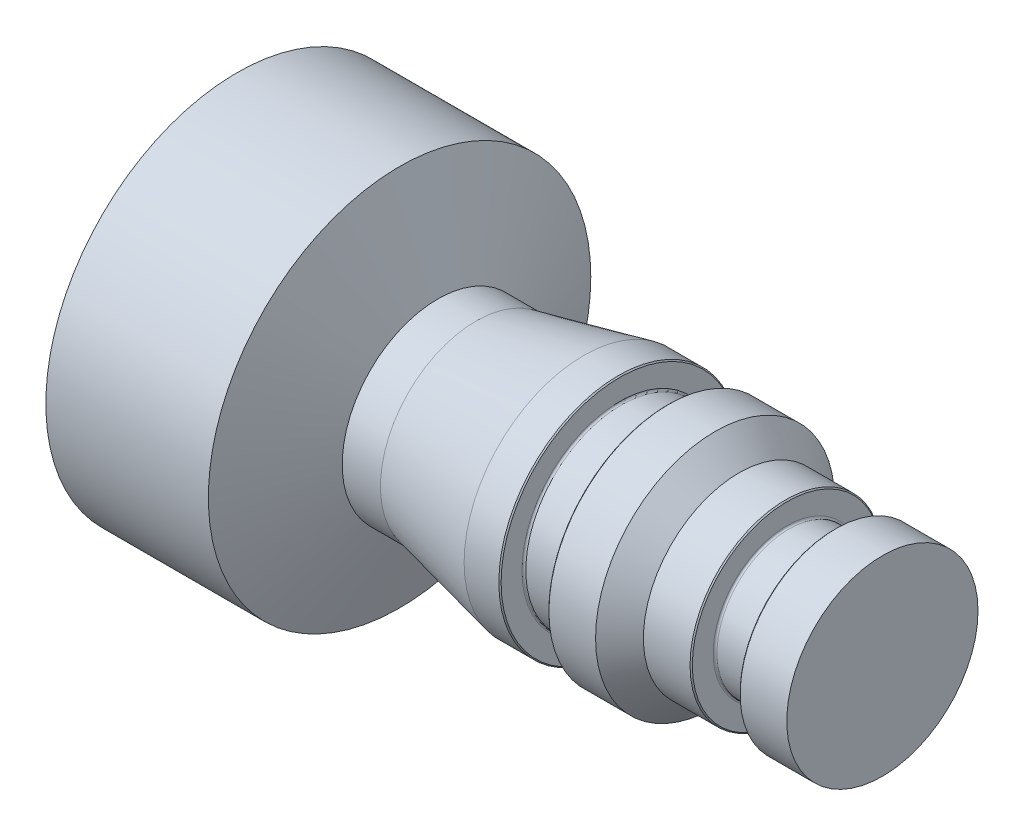
ISO-10303-21;
HEADER;
FILE_DESCRIPTION(('STEP AP214'),'2;1');
FILE_NAME('part.step','',(''),(''),'','','');
FILE_SCHEMA(('AUTOMOTIVE_DESIGN { 1 0 10303 214 1 1 1 1 }'));
ENDSEC;
DATA;
#1=APPLICATION_CONTEXT('core data for automotive mechanical design processes');
#2=APPLICATION_PROTOCOL_DEFINITION('international standard','automotive_design',2000,#1);
#3=PRODUCT_CONTEXT('',#1,'mechanical');
#4=PRODUCT('Part','Part','',(#3));
#5=PRODUCT_RELATED_PRODUCT_CATEGORY('part','',(#4));
#6=PRODUCT_DEFINITION_FORMATION('','',#4);
#7=PRODUCT_DEFINITION_CONTEXT('part definition',#1,'design');
#8=PRODUCT_DEFINITION('design','',#6,#7);
#9=PRODUCT_DEFINITION_SHAPE('','',#8);
#10=(LENGTH_UNIT() NAMED_UNIT(*) SI_UNIT(.MILLI.,.METRE.));
#11=(NAMED_UNIT(*) PLANE_ANGLE_UNIT() SI_UNIT($,.RADIAN.));
#12=(NAMED_UNIT(*) SI_UNIT($,.STERADIAN.) SOLID_ANGLE_UNIT());
#13=UNCERTAINTY_MEASURE_WITH_UNIT(LENGTH_MEASURE(1.E-05),#10,'distance_accuracy_value','');
#14=(GEOMETRIC_REPRESENTATION_CONTEXT(3) GLOBAL_UNCERTAINTY_ASSIGNED_CONTEXT((#13)) GLOBAL_UNIT_ASSIGNED_CONTEXT((#10,
#11,#12)) REPRESENTATION_CONTEXT('',''));
#15=CARTESIAN_POINT('',(0.,0.,0.));
#16=DIRECTION('',(0.,0.,1.));
#17=DIRECTION('',(1.,0.,0.));
#18=AXIS2_PLACEMENT_3D('',#15,#16,#17);
#19=CARTESIAN_POINT('',(-13.208,0.,0.));
#20=DIRECTION('',(1.,0.,0.));
#21=DIRECTION('',(0.,0.,-1.));
#22=AXIS2_PLACEMENT_3D('',#19,#20,#21);
#23=TOROIDAL_SURFACE('',#22,19.558,0.508000000000001);
#24=CARTESIAN_POINT('',(-13.208,0.,0.));
#25=DIRECTION('',(1.,0.,0.));
#26=DIRECTION('',(0.,0.,-1.));
#27=AXIS2_PLACEMENT_3D('',#24,#25,#26);
#28=CIRCLE('',#27,19.05);
#29=CARTESIAN_POINT('',(-13.208,0.,-19.05));
#30=VERTEX_POINT('',#29);
#31=EDGE_CURVE('E110',#30,#30,#28,.T.);
#32=ORIENTED_EDGE('',*,*,#31,.T.);
#33=EDGE_LOOP('',(#32));
#34=FACE_BOUND('',#33,.T.);
#35=CARTESIAN_POINT('',(-12.7,0.,0.));
#36=DIRECTION('',(1.,0.,0.));
#37=DIRECTION('',(0.,0.,-1.));
#38=AXIS2_PLACEMENT_3D('',#35,#36,#37);
#39=CIRCLE('',#38,19.558);
#40=CARTESIAN_POINT('',(-12.7,0.,-19.558));
#41=VERTEX_POINT('',#40);
#42=EDGE_CURVE('E65',#41,#41,#39,.T.);
#43=ORIENTED_EDGE('',*,*,#42,.F.);
#44=EDGE_LOOP('',(#43));
#45=FACE_BOUND('',#44,.T.);
#46=ADVANCED_FACE('F34',(#34,#45),#23,.F.);
#47=CARTESIAN_POINT('',(-12.7,19.558,0.));
#48=DIRECTION('',(1.,0.,0.));
#49=DIRECTION('',(0.,0.,-1.));
#50=AXIS2_PLACEMENT_3D('',#47,#48,#49);
#51=PLANE('',#50);
#52=CARTESIAN_POINT('',(-12.7,0.,0.));
#53=DIRECTION('',(1.,0.,0.));
#54=DIRECTION('',(0.,0.,-1.));
#55=AXIS2_PLACEMENT_3D('',#52,#53,#54);
#56=CIRCLE('',#55,25.0951999999999);
#57=CARTESIAN_POINT('',(-12.7,0.,-25.0951999999999));
#58=VERTEX_POINT('',#57);
#59=EDGE_CURVE('E10',#58,#58,#56,.F.);
#60=ORIENTED_EDGE('',*,*,#59,.T.);
#61=EDGE_LOOP('',(#60));
#62=FACE_BOUND('',#61,.T.);
#63=ORIENTED_EDGE('',*,*,#42,.T.);
#64=EDGE_LOOP('',(#63));
#65=FACE_BOUND('',#64,.T.);
#66=ADVANCED_FACE('F133',(#62,#65),#51,.F.);
#67=CARTESIAN_POINT('',(0.,0.,0.));
#68=DIRECTION('',(1.,0.,0.));
#69=DIRECTION('',(0.,0.,-1.));
#70=AXIS2_PLACEMENT_3D('',#67,#68,#69);
#71=CYLINDRICAL_SURFACE('',#70,25.3999999999999);
#72=CARTESIAN_POINT('',(-12.3952,0.,0.));
#73=DIRECTION('',(1.,0.,0.));
#74=DIRECTION('',(0.,0.,-1.));
#75=AXIS2_PLACEMENT_3D('',#72,#73,#74);
#76=CIRCLE('',#75,25.3999999999999);
#77=CARTESIAN_POINT('',(-12.3952,0.,-25.3999999999999));
#78=VERTEX_POINT('',#77);
#79=EDGE_CURVE('E40',#78,#78,#76,.T.);
#80=ORIENTED_EDGE('',*,*,#79,.T.);
#81=EDGE_LOOP('',(#80));
#82=FACE_BOUND('',#81,.T.);
#83=CARTESIAN_POINT('',(0.,0.,0.));
#84=DIRECTION('',(1.,0.,0.));
#85=DIRECTION('',(0.,0.,-1.));
#86=AXIS2_PLACEMENT_3D('',#83,#84,#85);
#87=CIRCLE('',#86,25.3999999999999);
#88=CARTESIAN_POINT('',(0.,0.,-25.3999999999999));
#89=VERTEX_POINT('',#88);
#90=EDGE_CURVE('E68',#89,#89,#87,.T.);
#91=ORIENTED_EDGE('',*,*,#90,.F.);
#92=EDGE_LOOP('',(#91));
#93=FACE_BOUND('',#92,.T.);
#94=ADVANCED_FACE('F137',(#82,#93),#71,.T.);
#95=CARTESIAN_POINT('',(0.,0.,0.));
#96=DIRECTION('',(1.,0.,0.));
#97=DIRECTION('',(0.,0.,-1.));
#98=AXIS2_PLACEMENT_3D('',#95,#96,#97);
#99=PLANE('',#98);
#100=ORIENTED_EDGE('',*,*,#90,.T.);
#101=EDGE_LOOP('',(#100));
#102=FACE_BOUND('',#101,.T.);
#103=ADVANCED_FACE('F141',(#102),#99,.T.);
#104=CARTESIAN_POINT('',(-171.45,50.8,0.));
#105=DIRECTION('',(-1.,0.,0.));
#106=DIRECTION('',(0.,0.,1.));
#107=AXIS2_PLACEMENT_3D('',#104,#105,#106);
#108=PLANE('',#107);
#109=CARTESIAN_POINT('',(-171.45,0.,0.));
#110=DIRECTION('',(1.,0.,0.));
#111=DIRECTION('',(0.,0.,-1.));
#112=AXIS2_PLACEMENT_3D('',#109,#110,#111);
#113=CIRCLE('',#112,50.8);
#114=CARTESIAN_POINT('',(-171.45,0.,-50.8));
#115=VERTEX_POINT('',#114);
#116=EDGE_CURVE('E71',#115,#115,#113,.T.);
#117=ORIENTED_EDGE('',*,*,#116,.F.);
#118=EDGE_LOOP('',(#117));
#119=FACE_BOUND('',#118,.T.);
#120=ADVANCED_FACE('F147',(#119),#108,.T.);
#121=CARTESIAN_POINT('',(0.,0.,0.));
#122=DIRECTION('',(1.,0.,0.));
#123=DIRECTION('',(0.,0.,-1.));
#124=AXIS2_PLACEMENT_3D('',#121,#122,#123);
#125=CYLINDRICAL_SURFACE('',#124,50.8);
#126=ORIENTED_EDGE('',*,*,#116,.T.);
#127=EDGE_LOOP('',(#126));
#128=FACE_BOUND('',#127,.T.);
#129=CARTESIAN_POINT('',(-128.27,0.,0.));
#130=DIRECTION('',(1.,0.,0.));
#131=DIRECTION('',(0.,0.,-1.));
#132=AXIS2_PLACEMENT_3D('',#129,#130,#131);
#133=CIRCLE('',#132,50.8);
#134=CARTESIAN_POINT('',(-128.27,0.,-50.8));
#135=VERTEX_POINT('',#134);
#136=EDGE_CURVE('E74',#135,#135,#133,.T.);
#137=ORIENTED_EDGE('',*,*,#136,.F.);
#138=EDGE_LOOP('',(#137));
#139=FACE_BOUND('',#138,.T.);
#140=ADVANCED_FACE('F151',(#128,#139),#125,.T.);
#141=CARTESIAN_POINT('',(-118.11,0.,0.));
#142=DIRECTION('',(-1.,0.,0.));
#143=DIRECTION('',(0.,0.,1.));
#144=AXIS2_PLACEMENT_3D('',#141,#142,#143);
#145=CONICAL_SURFACE('',#144,25.4,1.19028994968253);
#146=ORIENTED_EDGE('',*,*,#136,.T.);
#147=EDGE_LOOP('',(#146));
#148=FACE_BOUND('',#147,.T.);
#149=CARTESIAN_POINT('',(-118.11,0.,0.));
#150=DIRECTION('',(1.,0.,0.));
#151=DIRECTION('',(0.,0.,-1.));
#152=AXIS2_PLACEMENT_3D('',#149,#150,#151);
#153=CIRCLE('',#152,25.4);
#154=CARTESIAN_POINT('',(-118.11,0.,-25.4));
#155=VERTEX_POINT('',#154);
#156=EDGE_CURVE('E77',#155,#155,#153,.T.);
#157=ORIENTED_EDGE('',*,*,#156,.F.);
#158=EDGE_LOOP('',(#157));
#159=FACE_BOUND('',#158,.T.);
#160=ADVANCED_FACE('F155',(#148,#159),#145,.T.);
#161=CARTESIAN_POINT('',(0.,0.,0.));
#162=DIRECTION('',(1.,0.,0.));
#163=DIRECTION('',(0.,0.,-1.));
#164=AXIS2_PLACEMENT_3D('',#161,#162,#163);
#165=CYLINDRICAL_SURFACE('',#164,25.4);
#166=ORIENTED_EDGE('',*,*,#156,.T.);
#167=EDGE_LOOP('',(#166));
#168=FACE_BOUND('',#167,.T.);
#169=CARTESIAN_POINT('',(-107.95,0.,0.));
#170=DIRECTION('',(1.,0.,0.));
#171=DIRECTION('',(0.,0.,-1.));
#172=AXIS2_PLACEMENT_3D('',#169,#170,#171);
#173=CIRCLE('',#172,25.4);
#174=CARTESIAN_POINT('',(-107.95,0.,-25.4));
#175=VERTEX_POINT('',#174);
#176=EDGE_CURVE('E80',#175,#175,#173,.T.);
#177=ORIENTED_EDGE('',*,*,#176,.F.);
#178=EDGE_LOOP('',(#177));
#179=FACE_BOUND('',#178,.T.);
#180=ADVANCED_FACE('F159',(#168,#179),#165,.T.);
#181=CARTESIAN_POINT('',(-79.375,0.,0.));
#182=DIRECTION('',(1.,0.,0.));
#183=DIRECTION('',(0.,0.,-1.));
#184=AXIS2_PLACEMENT_3D('',#181,#182,#183);
#185=CONICAL_SURFACE('',#184,31.75,0.218668945873942);
#186=ORIENTED_EDGE('',*,*,#176,.T.);
#187=EDGE_LOOP('',(#186));
#188=FACE_BOUND('',#187,.T.);
#189=CARTESIAN_POINT('',(-79.375,0.,0.));
#190=DIRECTION('',(1.,0.,0.));
#191=DIRECTION('',(0.,0.,-1.));
#192=AXIS2_PLACEMENT_3D('',#189,#190,#191);
#193=CIRCLE('',#192,31.75);
#194=CARTESIAN_POINT('',(-79.375,0.,-31.75));
#195=VERTEX_POINT('',#194);
#196=EDGE_CURVE('E83',#195,#195,#193,.T.);
#197=ORIENTED_EDGE('',*,*,#196,.F.);
#198=EDGE_LOOP('',(#197));
#199=FACE_BOUND('',#198,.T.);
#200=ADVANCED_FACE('F163',(#188,#199),#185,.T.);
#201=CARTESIAN_POINT('',(0.,0.,0.));
#202=DIRECTION('',(1.,0.,0.));
#203=DIRECTION('',(0.,0.,-1.));
#204=AXIS2_PLACEMENT_3D('',#201,#202,#203);
#205=CYLINDRICAL_SURFACE('',#204,31.75);
#206=CARTESIAN_POINT('',(-70.1548,0.,0.));
#207=DIRECTION('',(-1.,0.,0.));
#208=DIRECTION('',(0.,0.,1.));
#209=AXIS2_PLACEMENT_3D('',#206,#207,#208);
#210=CIRCLE('',#209,31.75);
#211=CARTESIAN_POINT('',(-70.1548,0.,31.75));
#212=VERTEX_POINT('',#211);
#213=EDGE_CURVE('E59',#212,#212,#210,.T.);
#214=ORIENTED_EDGE('',*,*,#213,.T.);
#215=EDGE_LOOP('',(#214));
#216=FACE_BOUND('',#215,.T.);
#217=ORIENTED_EDGE('',*,*,#196,.T.);
#218=EDGE_LOOP('',(#217));
#219=FACE_BOUND('',#218,.T.);
#220=ADVANCED_FACE('F167',(#216,#219),#205,.T.);
#221=CARTESIAN_POINT('',(-69.85,31.75,0.));
#222=DIRECTION('',(-1.,0.,0.));
#223=DIRECTION('',(0.,0.,1.));
#224=AXIS2_PLACEMENT_3D('',#221,#222,#223);
#225=PLANE('',#224);
#226=CARTESIAN_POINT('',(-69.85,0.,0.));
#227=DIRECTION('',(-1.,0.,0.));
#228=DIRECTION('',(0.,0.,1.));
#229=AXIS2_PLACEMENT_3D('',#226,#227,#228);
#230=CIRCLE('',#229,31.4452);
#231=CARTESIAN_POINT('',(-69.85,0.,31.4452));
#232=VERTEX_POINT('',#231);
#233=EDGE_CURVE('E62',#232,#232,#230,.F.);
#234=ORIENTED_EDGE('',*,*,#233,.T.);
#235=EDGE_LOOP('',(#234));
#236=FACE_BOUND('',#235,.T.);
#237=CARTESIAN_POINT('',(-69.85,0.,0.));
#238=DIRECTION('',(1.,0.,0.));
#239=DIRECTION('',(0.,0.,-1.));
#240=AXIS2_PLACEMENT_3D('',#237,#238,#239);
#241=CIRCLE('',#240,25.908);
#242=CARTESIAN_POINT('',(-69.85,0.,-25.908));
#243=VERTEX_POINT('',#242);
#244=EDGE_CURVE('E86',#243,#243,#241,.T.);
#245=ORIENTED_EDGE('',*,*,#244,.F.);
#246=EDGE_LOOP('',(#245));
#247=FACE_BOUND('',#246,.T.);
#248=ADVANCED_FACE('F171',(#236,#247),#225,.F.);
#249=CARTESIAN_POINT('',(-69.342,0.,0.));
#250=DIRECTION('',(1.,0.,0.));
#251=DIRECTION('',(0.,0.,-1.));
#252=AXIS2_PLACEMENT_3D('',#249,#250,#251);
#253=TOROIDAL_SURFACE('',#252,25.908,0.507999999999998);
#254=ORIENTED_EDGE('',*,*,#244,.T.);
#255=EDGE_LOOP('',(#254));
#256=FACE_BOUND('',#255,.T.);
#257=CARTESIAN_POINT('',(-69.342,0.,0.));
#258=DIRECTION('',(1.,0.,0.));
#259=DIRECTION('',(0.,0.,-1.));
#260=AXIS2_PLACEMENT_3D('',#257,#258,#259);
#261=CIRCLE('',#260,25.4);
#262=CARTESIAN_POINT('',(-69.342,0.,-25.4));
#263=VERTEX_POINT('',#262);
#264=EDGE_CURVE('E89',#263,#263,#261,.T.);
#265=ORIENTED_EDGE('',*,*,#264,.F.);
#266=EDGE_LOOP('',(#265));
#267=FACE_BOUND('',#266,.T.);
#268=ADVANCED_FACE('F175',(#256,#267),#253,.F.);
#269=CARTESIAN_POINT('',(0.,0.,0.));
#270=DIRECTION('',(1.,0.,0.));
#271=DIRECTION('',(0.,0.,-1.));
#272=AXIS2_PLACEMENT_3D('',#269,#270,#271);
#273=CYLINDRICAL_SURFACE('',#272,25.4);
#274=ORIENTED_EDGE('',*,*,#264,.T.);
#275=EDGE_LOOP('',(#274));
#276=FACE_BOUND('',#275,.T.);
#277=CARTESIAN_POINT('',(-57.658,0.,0.));
#278=DIRECTION('',(1.,0.,0.));
#279=DIRECTION('',(0.,0.,-1.));
#280=AXIS2_PLACEMENT_3D('',#277,#278,#279);
#281=CIRCLE('',#280,25.4);
#282=CARTESIAN_POINT('',(-57.658,0.,-25.4));
#283=VERTEX_POINT('',#282);
#284=EDGE_CURVE('E92',#283,#283,#281,.T.);
#285=ORIENTED_EDGE('',*,*,#284,.F.);
#286=EDGE_LOOP('',(#285));
#287=FACE_BOUND('',#286,.T.);
#288=ADVANCED_FACE('F179',(#276,#287),#273,.T.);
#289=CARTESIAN_POINT('',(-57.658,0.,0.));
#290=DIRECTION('',(1.,0.,0.));
#291=DIRECTION('',(0.,0.,-1.));
#292=AXIS2_PLACEMENT_3D('',#289,#290,#291);
#293=TOROIDAL_SURFACE('',#292,25.908,0.508000000000002);
#294=ORIENTED_EDGE('',*,*,#284,.T.);
#295=EDGE_LOOP('',(#294));
#296=FACE_BOUND('',#295,.T.);
#297=CARTESIAN_POINT('',(-57.15,0.,0.));
#298=DIRECTION('',(1.,0.,0.));
#299=DIRECTION('',(0.,0.,-1.));
#300=AXIS2_PLACEMENT_3D('',#297,#298,#299);
#301=CIRCLE('',#300,25.908);
#302=CARTESIAN_POINT('',(-57.15,0.,-25.908));
#303=VERTEX_POINT('',#302);
#304=EDGE_CURVE('E95',#303,#303,#301,.T.);
#305=ORIENTED_EDGE('',*,*,#304,.F.);
#306=EDGE_LOOP('',(#305));
#307=FACE_BOUND('',#306,.T.);
#308=ADVANCED_FACE('F183',(#296,#307),#293,.F.);
#309=CARTESIAN_POINT('',(-57.15,25.908,0.));
#310=DIRECTION('',(1.,0.,0.));
#311=DIRECTION('',(0.,0.,-1.));
#312=AXIS2_PLACEMENT_3D('',#309,#310,#311);
#313=PLANE('',#312);
#314=CARTESIAN_POINT('',(-57.15,0.,0.));
#315=DIRECTION('',(1.,0.,0.));
#316=DIRECTION('',(0.,0.,-1.));
#317=AXIS2_PLACEMENT_3D('',#314,#315,#316);
#318=CIRCLE('',#317,31.4452);
#319=CARTESIAN_POINT('',(-57.15,0.,-31.4452));
#320=VERTEX_POINT('',#319);
#321=EDGE_CURVE('E53',#320,#320,#318,.F.);
#322=ORIENTED_EDGE('',*,*,#321,.T.);
#323=EDGE_LOOP('',(#322));
#324=FACE_BOUND('',#323,.T.);
#325=ORIENTED_EDGE('',*,*,#304,.T.);
#326=EDGE_LOOP('',(#325));
#327=FACE_BOUND('',#326,.T.);
#328=ADVANCED_FACE('F187',(#324,#327),#313,.F.);
#329=CARTESIAN_POINT('',(0.,0.,0.));
#330=DIRECTION('',(1.,0.,0.));
#331=DIRECTION('',(0.,0.,-1.));
#332=AXIS2_PLACEMENT_3D('',#329,#330,#331);
#333=CYLINDRICAL_SURFACE('',#332,31.75);
#334=CARTESIAN_POINT('',(-56.8452,0.,0.));
#335=DIRECTION('',(1.,0.,0.));
#336=DIRECTION('',(0.,0.,-1.));
#337=AXIS2_PLACEMENT_3D('',#334,#335,#336);
#338=CIRCLE('',#337,31.75);
#339=CARTESIAN_POINT('',(-56.8452,0.,-31.75));
#340=VERTEX_POINT('',#339);
#341=EDGE_CURVE('E56',#340,#340,#338,.T.);
#342=ORIENTED_EDGE('',*,*,#341,.T.);
#343=EDGE_LOOP('',(#342));
#344=FACE_BOUND('',#343,.T.);
#345=CARTESIAN_POINT('',(-44.45,0.,0.));
#346=DIRECTION('',(1.,0.,0.));
#347=DIRECTION('',(0.,0.,-1.));
#348=AXIS2_PLACEMENT_3D('',#345,#346,#347);
#349=CIRCLE('',#348,31.75);
#350=CARTESIAN_POINT('',(-44.45,0.,-31.75));
#351=VERTEX_POINT('',#350);
#352=EDGE_CURVE('E98',#351,#351,#349,.T.);
#353=ORIENTED_EDGE('',*,*,#352,.F.);
#354=EDGE_LOOP('',(#353));
#355=FACE_BOUND('',#354,.T.);
#356=ADVANCED_FACE('F191',(#344,#355),#333,.T.);
#357=CARTESIAN_POINT('',(-38.1,0.,0.));
#358=DIRECTION('',(-1.,0.,0.));
#359=DIRECTION('',(0.,0.,1.));
#360=AXIS2_PLACEMENT_3D('',#357,#358,#359);
#361=CONICAL_SURFACE('',#360,25.4,0.785398163397448);
#362=ORIENTED_EDGE('',*,*,#352,.T.);
#363=EDGE_LOOP('',(#362));
#364=FACE_BOUND('',#363,.T.);
#365=CARTESIAN_POINT('',(-38.1,0.,0.));
#366=DIRECTION('',(1.,0.,0.));
#367=DIRECTION('',(0.,0.,-1.));
#368=AXIS2_PLACEMENT_3D('',#365,#366,#367);
#369=CIRCLE('',#368,25.4);
#370=CARTESIAN_POINT('',(-38.1,0.,-25.4));
#371=VERTEX_POINT('',#370);
#372=EDGE_CURVE('E101',#371,#371,#369,.T.);
#373=ORIENTED_EDGE('',*,*,#372,.F.);
#374=EDGE_LOOP('',(#373));
#375=FACE_BOUND('',#374,.T.);
#376=ADVANCED_FACE('F195',(#364,#375),#361,.T.);
#377=CARTESIAN_POINT('',(0.,0.,0.));
#378=DIRECTION('',(1.,0.,0.));
#379=DIRECTION('',(0.,0.,-1.));
#380=AXIS2_PLACEMENT_3D('',#377,#378,#379);
#381=CYLINDRICAL_SURFACE('',#380,25.4);
#382=CARTESIAN_POINT('',(-25.7048,0.,0.));
#383=DIRECTION('',(-1.,0.,0.));
#384=DIRECTION('',(0.,0.,1.));
#385=AXIS2_PLACEMENT_3D('',#382,#383,#384);
#386=CIRCLE('',#385,25.4);
#387=CARTESIAN_POINT('',(-25.7048,0.,25.4));
#388=VERTEX_POINT('',#387);
#389=EDGE_CURVE('E44',#388,#388,#386,.T.);
#390=ORIENTED_EDGE('',*,*,#389,.T.);
#391=EDGE_LOOP('',(#390));
#392=FACE_BOUND('',#391,.T.);
#393=ORIENTED_EDGE('',*,*,#372,.T.);
#394=EDGE_LOOP('',(#393));
#395=FACE_BOUND('',#394,.T.);
#396=ADVANCED_FACE('F199',(#392,#395),#381,.T.);
#397=CARTESIAN_POINT('',(-25.4,25.4,0.));
#398=DIRECTION('',(-1.,0.,0.));
#399=DIRECTION('',(0.,0.,1.));
#400=AXIS2_PLACEMENT_3D('',#397,#398,#399);
#401=PLANE('',#400);
#402=CARTESIAN_POINT('',(-25.4,0.,0.));
#403=DIRECTION('',(-1.,0.,0.));
#404=DIRECTION('',(0.,0.,1.));
#405=AXIS2_PLACEMENT_3D('',#402,#403,#404);
#406=CIRCLE('',#405,25.0952);
#407=CARTESIAN_POINT('',(-25.4,0.,25.0952));
#408=VERTEX_POINT('',#407);
#409=EDGE_CURVE('E48',#408,#408,#406,.F.);
#410=ORIENTED_EDGE('',*,*,#409,.T.);
#411=EDGE_LOOP('',(#410));
#412=FACE_BOUND('',#411,.T.);
#413=CARTESIAN_POINT('',(-25.4,0.,0.));
#414=DIRECTION('',(1.,0.,0.));
#415=DIRECTION('',(0.,0.,-1.));
#416=AXIS2_PLACEMENT_3D('',#413,#414,#415);
#417=CIRCLE('',#416,19.558);
#418=CARTESIAN_POINT('',(-25.4,0.,-19.558));
#419=VERTEX_POINT('',#418);
#420=EDGE_CURVE('E104',#419,#419,#417,.T.);
#421=ORIENTED_EDGE('',*,*,#420,.F.);
#422=EDGE_LOOP('',(#421));
#423=FACE_BOUND('',#422,.T.);
#424=ADVANCED_FACE('F129',(#412,#423),#401,.F.);
#425=CARTESIAN_POINT('',(-24.892,0.,0.));
#426=DIRECTION('',(1.,0.,0.));
#427=DIRECTION('',(0.,0.,-1.));
#428=AXIS2_PLACEMENT_3D('',#425,#426,#427);
#429=TOROIDAL_SURFACE('',#428,19.558,0.508000000000002);
#430=CARTESIAN_POINT('',(-24.892,0.,0.));
#431=DIRECTION('',(1.,0.,0.));
#432=DIRECTION('',(0.,0.,-1.));
#433=AXIS2_PLACEMENT_3D('',#430,#431,#432);
#434=CIRCLE('',#433,19.05);
#435=CARTESIAN_POINT('',(-24.892,0.,-19.05));
#436=VERTEX_POINT('',#435);
#437=EDGE_CURVE('E107',#436,#436,#434,.T.);
#438=ORIENTED_EDGE('',*,*,#437,.F.);
#439=EDGE_LOOP('',(#438));
#440=FACE_BOUND('',#439,.T.);
#441=ORIENTED_EDGE('',*,*,#420,.T.);
#442=EDGE_LOOP('',(#441));
#443=FACE_BOUND('',#442,.T.);
#444=ADVANCED_FACE('F119',(#440,#443),#429,.F.);
#445=CARTESIAN_POINT('',(0.,0.,0.));
#446=DIRECTION('',(1.,0.,0.));
#447=DIRECTION('',(0.,0.,-1.));
#448=AXIS2_PLACEMENT_3D('',#445,#446,#447);
#449=CYLINDRICAL_SURFACE('',#448,19.05);
#450=ORIENTED_EDGE('',*,*,#437,.T.);
#451=EDGE_LOOP('',(#450));
#452=FACE_BOUND('',#451,.T.);
#453=ORIENTED_EDGE('',*,*,#31,.F.);
#454=EDGE_LOOP('',(#453));
#455=FACE_BOUND('',#454,.T.);
#456=ADVANCED_FACE('F116',(#452,#455),#449,.T.);
#457=CARTESIAN_POINT('',(-69.85,0.,0.));
#458=DIRECTION('',(-1.,0.,0.));
#459=DIRECTION('',(0.,0.,1.));
#460=AXIS2_PLACEMENT_3D('',#457,#458,#459);
#461=CONICAL_SURFACE('',#460,31.4452,0.785398163397448);
#462=ORIENTED_EDGE('',*,*,#213,.F.);
#463=EDGE_LOOP('',(#462));
#464=FACE_BOUND('',#463,.T.);
#465=ORIENTED_EDGE('',*,*,#233,.F.);
#466=EDGE_LOOP('',(#465));
#467=FACE_BOUND('',#466,.T.);
#468=ADVANCED_FACE('F118',(#464,#467),#461,.T.);
#469=CARTESIAN_POINT('',(-56.8452,0.,0.));
#470=DIRECTION('',(1.,0.,0.));
#471=DIRECTION('',(0.,0.,-1.));
#472=AXIS2_PLACEMENT_3D('',#469,#470,#471);
#473=CONICAL_SURFACE('',#472,31.75,0.785398163397437);
#474=ORIENTED_EDGE('',*,*,#321,.F.);
#475=EDGE_LOOP('',(#474));
#476=FACE_BOUND('',#475,.T.);
#477=ORIENTED_EDGE('',*,*,#341,.F.);
#478=EDGE_LOOP('',(#477));
#479=FACE_BOUND('',#478,.T.);
#480=ADVANCED_FACE('F126',(#476,#479),#473,.T.);
#481=CARTESIAN_POINT('',(-25.4,0.,0.));
#482=DIRECTION('',(-1.,0.,0.));
#483=DIRECTION('',(0.,0.,1.));
#484=AXIS2_PLACEMENT_3D('',#481,#482,#483);
#485=CONICAL_SURFACE('',#484,25.0952,0.785398163397454);
#486=ORIENTED_EDGE('',*,*,#389,.F.);
#487=EDGE_LOOP('',(#486));
#488=FACE_BOUND('',#487,.T.);
#489=ORIENTED_EDGE('',*,*,#409,.F.);
#490=EDGE_LOOP('',(#489));
#491=FACE_BOUND('',#490,.T.);
#492=ADVANCED_FACE('F213',(#488,#491),#485,.T.);
#493=CARTESIAN_POINT('',(-12.3952,0.,0.));
#494=DIRECTION('',(1.,0.,0.));
#495=DIRECTION('',(0.,0.,-1.));
#496=AXIS2_PLACEMENT_3D('',#493,#494,#495);
#497=CONICAL_SURFACE('',#496,25.3999999999999,0.78539816339744);
#498=ORIENTED_EDGE('',*,*,#59,.F.);
#499=EDGE_LOOP('',(#498));
#500=FACE_BOUND('',#499,.T.);
#501=ORIENTED_EDGE('',*,*,#79,.F.);
#502=EDGE_LOOP('',(#501));
#503=FACE_BOUND('',#502,.T.);
#504=ADVANCED_FACE('F215',(#500,#503),#497,.T.);
#505=CLOSED_SHELL('',(#46,#66,#94,#103,#120,#140,#160,#180,#200,#220,#248,#268,#288,#308,#328,
#356,#376,#396,#424,#444,#456,#468,#480,#492,#504));
#506=MANIFOLD_SOLID_BREP('B2',#505);
#507=ADVANCED_BREP_SHAPE_REPRESENTATION('',(#18,#506),#14);
#508=SHAPE_DEFINITION_REPRESENTATION(#9,#507);
ENDSEC;
END-ISO-10303-21;
